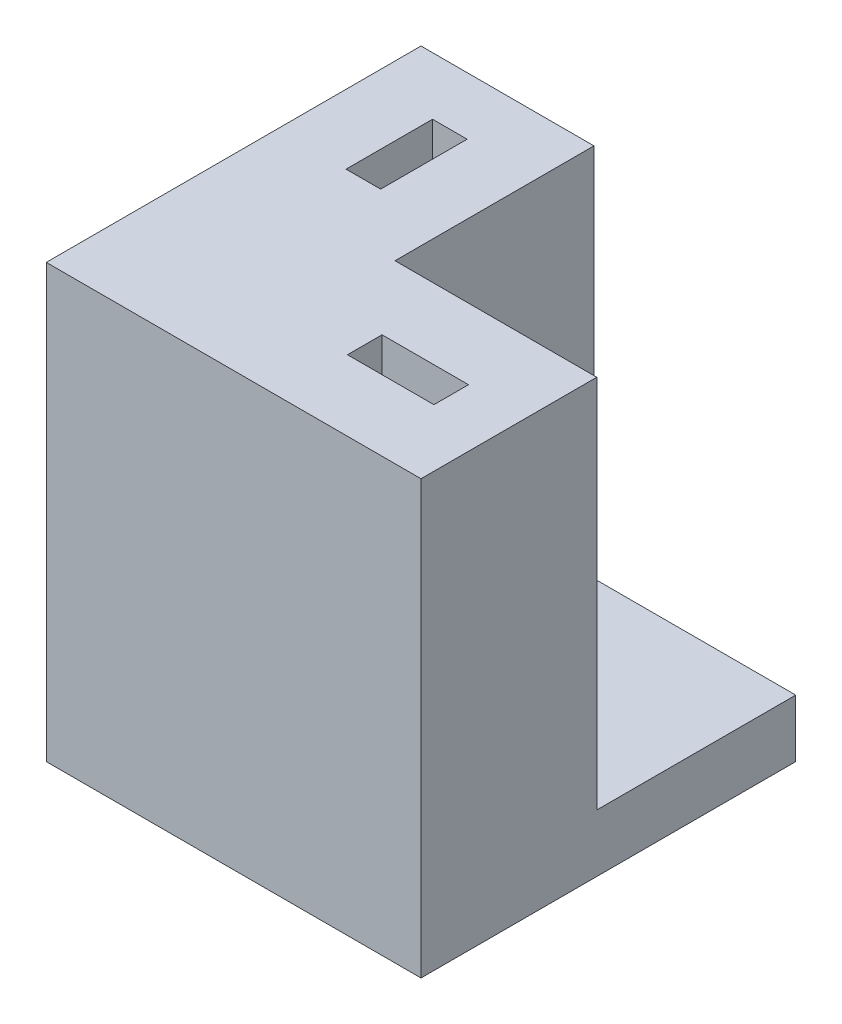
ISO-10303-21;
HEADER;
FILE_DESCRIPTION(('STEP AP214'),'2;1');
FILE_NAME('part.step','',(''),(''),'','','');
FILE_SCHEMA(('AUTOMOTIVE_DESIGN { 1 0 10303 214 1 1 1 1 }'));
ENDSEC;
DATA;
#1=APPLICATION_CONTEXT('core data for automotive mechanical design processes');
#2=APPLICATION_PROTOCOL_DEFINITION('international standard','automotive_design',2000,#1);
#3=PRODUCT_CONTEXT('',#1,'mechanical');
#4=PRODUCT('Part','Part','',(#3));
#5=PRODUCT_RELATED_PRODUCT_CATEGORY('part','',(#4));
#6=PRODUCT_DEFINITION_FORMATION('','',#4);
#7=PRODUCT_DEFINITION_CONTEXT('part definition',#1,'design');
#8=PRODUCT_DEFINITION('design','',#6,#7);
#9=PRODUCT_DEFINITION_SHAPE('','',#8);
#10=(LENGTH_UNIT() NAMED_UNIT(*) SI_UNIT(.MILLI.,.METRE.));
#11=(NAMED_UNIT(*) PLANE_ANGLE_UNIT() SI_UNIT($,.RADIAN.));
#12=(NAMED_UNIT(*) SI_UNIT($,.STERADIAN.) SOLID_ANGLE_UNIT());
#13=UNCERTAINTY_MEASURE_WITH_UNIT(LENGTH_MEASURE(1.E-05),#10,'distance_accuracy_value','');
#14=(GEOMETRIC_REPRESENTATION_CONTEXT(3) GLOBAL_UNCERTAINTY_ASSIGNED_CONTEXT((#13)) GLOBAL_UNIT_ASSIGNED_CONTEXT((#10,
#11,#12)) REPRESENTATION_CONTEXT('',''));
#15=CARTESIAN_POINT('',(0.,0.,0.));
#16=DIRECTION('',(0.,0.,1.));
#17=DIRECTION('',(1.,0.,0.));
#18=AXIS2_PLACEMENT_3D('',#15,#16,#17);
#19=CARTESIAN_POINT('',(8.255,19.05,8.255));
#20=DIRECTION('',(-1.,0.,0.));
#21=DIRECTION('',(0.,0.,1.));
#22=AXIS2_PLACEMENT_3D('',#19,#20,#21);
#23=PLANE('',#22);
#24=DIRECTION('',(0.,0.,-1.));
#25=VECTOR('',#24,1.);
#26=CARTESIAN_POINT('',(8.255,2.54,-8.255));
#27=LINE('',#26,#25);
#28=CARTESIAN_POINT('',(8.255,2.54,0.510916865217759));
#29=VERTEX_POINT('',#28);
#30=CARTESIAN_POINT('',(8.255,2.54,-8.255));
#31=VERTEX_POINT('',#30);
#32=EDGE_CURVE('E211',#29,#31,#27,.T.);
#33=ORIENTED_EDGE('',*,*,#32,.F.);
#34=DIRECTION('',(0.,1.,0.));
#35=VECTOR('',#34,1.);
#36=CARTESIAN_POINT('',(8.255,2.54,0.510916865217759));
#37=LINE('',#36,#35);
#38=CARTESIAN_POINT('',(8.255,19.05,0.510916865217759));
#39=VERTEX_POINT('',#38);
#40=EDGE_CURVE('E227',#29,#39,#37,.T.);
#41=ORIENTED_EDGE('',*,*,#40,.T.);
#42=DIRECTION('',(0.,0.,-1.));
#43=VECTOR('',#42,1.);
#44=CARTESIAN_POINT('',(8.255,19.05,8.255));
#45=LINE('',#44,#43);
#46=CARTESIAN_POINT('',(8.255,19.05,8.255));
#47=VERTEX_POINT('',#46);
#48=EDGE_CURVE('E240',#47,#39,#45,.T.);
#49=ORIENTED_EDGE('',*,*,#48,.F.);
#50=DIRECTION('',(0.,-1.,0.));
#51=VECTOR('',#50,1.);
#52=CARTESIAN_POINT('',(8.255,19.05,8.255));
#53=LINE('',#52,#51);
#54=CARTESIAN_POINT('',(8.255,0.,8.255));
#55=VERTEX_POINT('',#54);
#56=EDGE_CURVE('E250',#47,#55,#53,.T.);
#57=ORIENTED_EDGE('',*,*,#56,.T.);
#58=DIRECTION('',(0.,0.,-1.));
#59=VECTOR('',#58,1.);
#60=CARTESIAN_POINT('',(8.255,0.,8.255));
#61=LINE('',#60,#59);
#62=CARTESIAN_POINT('',(8.255,0.,-8.255));
#63=VERTEX_POINT('',#62);
#64=EDGE_CURVE('E237',#55,#63,#61,.T.);
#65=ORIENTED_EDGE('',*,*,#64,.T.);
#66=DIRECTION('',(0.,-1.,0.));
#67=VECTOR('',#66,1.);
#68=CARTESIAN_POINT('',(8.255,19.05,-8.255));
#69=LINE('',#68,#67);
#70=EDGE_CURVE('E11',#31,#63,#69,.T.);
#71=ORIENTED_EDGE('',*,*,#70,.F.);
#72=EDGE_LOOP('',(#33,#41,#49,#57,#65,#71));
#73=FACE_BOUND('',#72,.T.);
#74=ADVANCED_FACE('F37',(#73),#23,.F.);
#75=CARTESIAN_POINT('',(-8.255,19.05,-8.255));
#76=DIRECTION('',(0.,0.,1.));
#77=DIRECTION('',(1.,0.,0.));
#78=AXIS2_PLACEMENT_3D('',#75,#76,#77);
#79=PLANE('',#78);
#80=DIRECTION('',(-1.,0.,0.));
#81=VECTOR('',#80,1.);
#82=CARTESIAN_POINT('',(-8.255,19.05,-8.255));
#83=LINE('',#82,#81);
#84=CARTESIAN_POINT('',(-0.635,19.05,-8.255));
#85=VERTEX_POINT('',#84);
#86=CARTESIAN_POINT('',(-8.255,19.05,-8.255));
#87=VERTEX_POINT('',#86);
#88=EDGE_CURVE('E243',#85,#87,#83,.T.);
#89=ORIENTED_EDGE('',*,*,#88,.F.);
#90=DIRECTION('',(0.,1.,0.));
#91=VECTOR('',#90,1.);
#92=CARTESIAN_POINT('',(-0.635,2.54,-8.255));
#93=LINE('',#92,#91);
#94=CARTESIAN_POINT('',(-0.635,2.54,-8.255));
#95=VERTEX_POINT('',#94);
#96=EDGE_CURVE('E223',#95,#85,#93,.T.);
#97=ORIENTED_EDGE('',*,*,#96,.F.);
#98=DIRECTION('',(-1.,0.,0.));
#99=VECTOR('',#98,1.);
#100=CARTESIAN_POINT('',(-0.635,2.54,-8.255));
#101=LINE('',#100,#99);
#102=EDGE_CURVE('E213',#31,#95,#101,.T.);
#103=ORIENTED_EDGE('',*,*,#102,.F.);
#104=ORIENTED_EDGE('',*,*,#70,.T.);
#105=DIRECTION('',(-1.,0.,0.));
#106=VECTOR('',#105,1.);
#107=CARTESIAN_POINT('',(-8.255,0.,-8.255));
#108=LINE('',#107,#106);
#109=CARTESIAN_POINT('',(-8.255,0.,-8.255));
#110=VERTEX_POINT('',#109);
#111=EDGE_CURVE('E253',#63,#110,#108,.T.);
#112=ORIENTED_EDGE('',*,*,#111,.T.);
#113=DIRECTION('',(0.,-1.,0.));
#114=VECTOR('',#113,1.);
#115=CARTESIAN_POINT('',(-8.255,19.05,-8.255));
#116=LINE('',#115,#114);
#117=EDGE_CURVE('E44',#87,#110,#116,.T.);
#118=ORIENTED_EDGE('',*,*,#117,.F.);
#119=EDGE_LOOP('',(#89,#97,#103,#104,#112,#118));
#120=FACE_BOUND('',#119,.T.);
#121=ADVANCED_FACE('F289',(#120),#79,.F.);
#122=CARTESIAN_POINT('',(-8.255,19.05,8.255));
#123=DIRECTION('',(1.,0.,0.));
#124=DIRECTION('',(0.,0.,-1.));
#125=AXIS2_PLACEMENT_3D('',#122,#123,#124);
#126=PLANE('',#125);
#127=DIRECTION('',(0.,0.,1.));
#128=VECTOR('',#127,1.);
#129=CARTESIAN_POINT('',(-8.255,0.,8.255));
#130=LINE('',#129,#128);
#131=CARTESIAN_POINT('',(-8.255,0.,8.255));
#132=VERTEX_POINT('',#131);
#133=EDGE_CURVE('E255',#110,#132,#130,.T.);
#134=ORIENTED_EDGE('',*,*,#133,.T.);
#135=DIRECTION('',(0.,-1.,0.));
#136=VECTOR('',#135,1.);
#137=CARTESIAN_POINT('',(-8.255,19.05,8.255));
#138=LINE('',#137,#136);
#139=CARTESIAN_POINT('',(-8.255,19.05,8.255));
#140=VERTEX_POINT('',#139);
#141=EDGE_CURVE('E260',#140,#132,#138,.T.);
#142=ORIENTED_EDGE('',*,*,#141,.F.);
#143=DIRECTION('',(0.,0.,1.));
#144=VECTOR('',#143,1.);
#145=CARTESIAN_POINT('',(-8.255,19.05,8.255));
#146=LINE('',#145,#144);
#147=EDGE_CURVE('E246',#87,#140,#146,.T.);
#148=ORIENTED_EDGE('',*,*,#147,.F.);
#149=ORIENTED_EDGE('',*,*,#117,.T.);
#150=EDGE_LOOP('',(#134,#142,#148,#149));
#151=FACE_BOUND('',#150,.T.);
#152=ADVANCED_FACE('F267',(#151),#126,.F.);
#153=CARTESIAN_POINT('',(-8.255,19.05,8.255));
#154=DIRECTION('',(0.,0.,-1.));
#155=DIRECTION('',(-1.,0.,0.));
#156=AXIS2_PLACEMENT_3D('',#153,#154,#155);
#157=PLANE('',#156);
#158=DIRECTION('',(1.,0.,0.));
#159=VECTOR('',#158,1.);
#160=CARTESIAN_POINT('',(-8.255,0.,8.255));
#161=LINE('',#160,#159);
#162=EDGE_CURVE('E244',#132,#55,#161,.T.);
#163=ORIENTED_EDGE('',*,*,#162,.T.);
#164=ORIENTED_EDGE('',*,*,#56,.F.);
#165=DIRECTION('',(1.,0.,0.));
#166=VECTOR('',#165,1.);
#167=CARTESIAN_POINT('',(-8.255,19.05,8.255));
#168=LINE('',#167,#166);
#169=EDGE_CURVE('E248',#140,#47,#168,.T.);
#170=ORIENTED_EDGE('',*,*,#169,.F.);
#171=ORIENTED_EDGE('',*,*,#141,.T.);
#172=EDGE_LOOP('',(#163,#164,#170,#171));
#173=FACE_BOUND('',#172,.T.);
#174=ADVANCED_FACE('F278',(#173),#157,.F.);
#175=CARTESIAN_POINT('',(0.,19.05,0.));
#176=DIRECTION('',(0.,-1.,0.));
#177=DIRECTION('',(0.,0.,-1.));
#178=AXIS2_PLACEMENT_3D('',#175,#176,#177);
#179=PLANE('',#178);
#180=DIRECTION('',(-1.,0.,0.));
#181=VECTOR('',#180,1.);
#182=CARTESIAN_POINT('',(-5.207,19.05,-5.715));
#183=LINE('',#182,#181);
#184=CARTESIAN_POINT('',(-3.683,19.05,-5.715));
#185=VERTEX_POINT('',#184);
#186=CARTESIAN_POINT('',(-5.207,19.05,-5.715));
#187=VERTEX_POINT('',#186);
#188=EDGE_CURVE('E171',#185,#187,#183,.T.);
#189=ORIENTED_EDGE('',*,*,#188,.F.);
#190=DIRECTION('',(0.,0.,-1.));
#191=VECTOR('',#190,1.);
#192=CARTESIAN_POINT('',(-3.683,19.05,-1.905));
#193=LINE('',#192,#191);
#194=CARTESIAN_POINT('',(-3.683,19.05,-1.905));
#195=VERTEX_POINT('',#194);
#196=EDGE_CURVE('E51',#195,#185,#193,.T.);
#197=ORIENTED_EDGE('',*,*,#196,.F.);
#198=DIRECTION('',(1.,0.,0.));
#199=VECTOR('',#198,1.);
#200=CARTESIAN_POINT('',(-5.207,19.05,-1.905));
#201=LINE('',#200,#199);
#202=CARTESIAN_POINT('',(-5.207,19.05,-1.905));
#203=VERTEX_POINT('',#202);
#204=EDGE_CURVE('E162',#203,#195,#201,.T.);
#205=ORIENTED_EDGE('',*,*,#204,.F.);
#206=DIRECTION('',(0.,0.,1.));
#207=VECTOR('',#206,1.);
#208=CARTESIAN_POINT('',(-5.207,19.05,-1.905));
#209=LINE('',#208,#207);
#210=EDGE_CURVE('E165',#187,#203,#209,.T.);
#211=ORIENTED_EDGE('',*,*,#210,.F.);
#212=EDGE_LOOP('',(#189,#197,#205,#211));
#213=FACE_BOUND('',#212,.T.);
#214=DIRECTION('',(-1.,0.,0.));
#215=VECTOR('',#214,1.);
#216=CARTESIAN_POINT('',(1.905,19.05,3.62095843260888));
#217=LINE('',#216,#215);
#218=CARTESIAN_POINT('',(5.715,19.05,3.62095843260888));
#219=VERTEX_POINT('',#218);
#220=CARTESIAN_POINT('',(1.905,19.05,3.62095843260888));
#221=VERTEX_POINT('',#220);
#222=EDGE_CURVE('E197',#219,#221,#217,.T.);
#223=ORIENTED_EDGE('',*,*,#222,.F.);
#224=DIRECTION('',(0.,0.,-1.));
#225=VECTOR('',#224,1.);
#226=CARTESIAN_POINT('',(5.715,19.05,5.14495843260888));
#227=LINE('',#226,#225);
#228=CARTESIAN_POINT('',(5.715,19.05,5.14495843260888));
#229=VERTEX_POINT('',#228);
#230=EDGE_CURVE('E59',#229,#219,#227,.T.);
#231=ORIENTED_EDGE('',*,*,#230,.F.);
#232=DIRECTION('',(1.,0.,0.));
#233=VECTOR('',#232,1.);
#234=CARTESIAN_POINT('',(1.905,19.05,5.14495843260888));
#235=LINE('',#234,#233);
#236=CARTESIAN_POINT('',(1.905,19.05,5.14495843260888));
#237=VERTEX_POINT('',#236);
#238=EDGE_CURVE('E186',#237,#229,#235,.T.);
#239=ORIENTED_EDGE('',*,*,#238,.F.);
#240=DIRECTION('',(0.,0.,1.));
#241=VECTOR('',#240,1.);
#242=CARTESIAN_POINT('',(1.905,19.05,5.14495843260888));
#243=LINE('',#242,#241);
#244=EDGE_CURVE('E200',#221,#237,#243,.T.);
#245=ORIENTED_EDGE('',*,*,#244,.F.);
#246=EDGE_LOOP('',(#223,#231,#239,#245));
#247=FACE_BOUND('',#246,.T.);
#248=ORIENTED_EDGE('',*,*,#48,.T.);
#249=DIRECTION('',(1.,0.,0.));
#250=VECTOR('',#249,1.);
#251=CARTESIAN_POINT('',(8.255,19.05,0.510916865217759));
#252=LINE('',#251,#250);
#253=CARTESIAN_POINT('',(-0.635,19.05,0.51091686521776));
#254=VERTEX_POINT('',#253);
#255=EDGE_CURVE('E214',#254,#39,#252,.T.);
#256=ORIENTED_EDGE('',*,*,#255,.F.);
#257=DIRECTION('',(0.,0.,1.));
#258=VECTOR('',#257,1.);
#259=CARTESIAN_POINT('',(-0.635,19.05,0.51091686521776));
#260=LINE('',#259,#258);
#261=EDGE_CURVE('E178',#85,#254,#260,.T.);
#262=ORIENTED_EDGE('',*,*,#261,.F.);
#263=ORIENTED_EDGE('',*,*,#88,.T.);
#264=ORIENTED_EDGE('',*,*,#147,.T.);
#265=ORIENTED_EDGE('',*,*,#169,.T.);
#266=EDGE_LOOP('',(#248,#256,#262,#263,#264,#265));
#267=FACE_BOUND('',#266,.T.);
#268=ADVANCED_FACE('F286',(#213,#247,#267),#179,.F.);
#269=CARTESIAN_POINT('',(0.,0.,0.));
#270=DIRECTION('',(0.,-1.,0.));
#271=DIRECTION('',(0.,0.,-1.));
#272=AXIS2_PLACEMENT_3D('',#269,#270,#271);
#273=PLANE('',#272);
#274=CARTESIAN_POINT('',(-4.1275,0.,4.1275));
#275=DIRECTION('',(0.,-1.,0.));
#276=DIRECTION('',(0.,0.,-1.));
#277=AXIS2_PLACEMENT_3D('',#274,#275,#276);
#278=CIRCLE('',#277,2.54);
#279=CARTESIAN_POINT('',(-4.1275,0.,1.5875));
#280=VERTEX_POINT('',#279);
#281=EDGE_CURVE('E230',#280,#280,#278,.T.);
#282=ORIENTED_EDGE('',*,*,#281,.F.);
#283=EDGE_LOOP('',(#282));
#284=FACE_BOUND('',#283,.T.);
#285=ORIENTED_EDGE('',*,*,#64,.F.);
#286=ORIENTED_EDGE('',*,*,#162,.F.);
#287=ORIENTED_EDGE('',*,*,#133,.F.);
#288=ORIENTED_EDGE('',*,*,#111,.F.);
#289=EDGE_LOOP('',(#285,#286,#287,#288));
#290=FACE_BOUND('',#289,.T.);
#291=ADVANCED_FACE('F275',(#284,#290),#273,.T.);
#292=CARTESIAN_POINT('',(-4.1275,5.715,4.1275));
#293=DIRECTION('',(0.,-1.,0.));
#294=DIRECTION('',(0.,0.,-1.));
#295=AXIS2_PLACEMENT_3D('',#292,#293,#294);
#296=CYLINDRICAL_SURFACE('',#295,2.54);
#297=CARTESIAN_POINT('',(-4.1275,5.715,4.1275));
#298=DIRECTION('',(0.,-1.,0.));
#299=DIRECTION('',(0.,0.,-1.));
#300=AXIS2_PLACEMENT_3D('',#297,#298,#299);
#301=CIRCLE('',#300,2.54);
#302=CARTESIAN_POINT('',(-4.1275,5.715,1.5875));
#303=VERTEX_POINT('',#302);
#304=EDGE_CURVE('E234',#303,#303,#301,.T.);
#305=ORIENTED_EDGE('',*,*,#304,.F.);
#306=EDGE_LOOP('',(#305));
#307=FACE_BOUND('',#306,.T.);
#308=ORIENTED_EDGE('',*,*,#281,.T.);
#309=EDGE_LOOP('',(#308));
#310=FACE_BOUND('',#309,.T.);
#311=ADVANCED_FACE('F306',(#307,#310),#296,.F.);
#312=CARTESIAN_POINT('',(-4.1275,5.715,4.1275));
#313=DIRECTION('',(0.,-1.,0.));
#314=DIRECTION('',(0.,0.,-1.));
#315=AXIS2_PLACEMENT_3D('',#312,#313,#314);
#316=PLANE('',#315);
#317=ORIENTED_EDGE('',*,*,#304,.T.);
#318=EDGE_LOOP('',(#317));
#319=FACE_BOUND('',#318,.T.);
#320=ADVANCED_FACE('F299',(#319),#316,.T.);
#321=CARTESIAN_POINT('',(8.255,2.54,0.510916865217759));
#322=DIRECTION('',(0.,0.,1.));
#323=DIRECTION('',(1.,0.,0.));
#324=AXIS2_PLACEMENT_3D('',#321,#322,#323);
#325=PLANE('',#324);
#326=ORIENTED_EDGE('',*,*,#255,.T.);
#327=ORIENTED_EDGE('',*,*,#40,.F.);
#328=DIRECTION('',(1.,0.,0.));
#329=VECTOR('',#328,1.);
#330=CARTESIAN_POINT('',(8.255,2.54,0.510916865217759));
#331=LINE('',#330,#329);
#332=CARTESIAN_POINT('',(-0.635,2.54,0.51091686521776));
#333=VERTEX_POINT('',#332);
#334=EDGE_CURVE('E220',#333,#29,#331,.T.);
#335=ORIENTED_EDGE('',*,*,#334,.F.);
#336=DIRECTION('',(0.,1.,0.));
#337=VECTOR('',#336,1.);
#338=CARTESIAN_POINT('',(-0.635,2.54,0.51091686521776));
#339=LINE('',#338,#337);
#340=EDGE_CURVE('E231',#333,#254,#339,.T.);
#341=ORIENTED_EDGE('',*,*,#340,.T.);
#342=EDGE_LOOP('',(#326,#327,#335,#341));
#343=FACE_BOUND('',#342,.T.);
#344=ADVANCED_FACE('F297',(#343),#325,.F.);
#345=CARTESIAN_POINT('',(-0.635,2.54,0.51091686521776));
#346=DIRECTION('',(-1.,0.,0.));
#347=DIRECTION('',(0.,0.,1.));
#348=AXIS2_PLACEMENT_3D('',#345,#346,#347);
#349=PLANE('',#348);
#350=ORIENTED_EDGE('',*,*,#261,.T.);
#351=ORIENTED_EDGE('',*,*,#340,.F.);
#352=DIRECTION('',(0.,0.,1.));
#353=VECTOR('',#352,1.);
#354=CARTESIAN_POINT('',(-0.635,2.54,0.51091686521776));
#355=LINE('',#354,#353);
#356=EDGE_CURVE('E217',#95,#333,#355,.T.);
#357=ORIENTED_EDGE('',*,*,#356,.F.);
#358=ORIENTED_EDGE('',*,*,#96,.T.);
#359=EDGE_LOOP('',(#350,#351,#357,#358));
#360=FACE_BOUND('',#359,.T.);
#361=ADVANCED_FACE('F292',(#360),#349,.F.);
#362=CARTESIAN_POINT('',(0.,2.54,0.));
#363=DIRECTION('',(0.,-1.,0.));
#364=DIRECTION('',(0.,0.,-1.));
#365=AXIS2_PLACEMENT_3D('',#362,#363,#364);
#366=PLANE('',#365);
#367=ORIENTED_EDGE('',*,*,#32,.T.);
#368=ORIENTED_EDGE('',*,*,#102,.T.);
#369=ORIENTED_EDGE('',*,*,#356,.T.);
#370=ORIENTED_EDGE('',*,*,#334,.T.);
#371=EDGE_LOOP('',(#367,#368,#369,#370));
#372=FACE_BOUND('',#371,.T.);
#373=ADVANCED_FACE('F295',(#372),#366,.F.);
#374=CARTESIAN_POINT('',(5.715,16.51,5.14495843260888));
#375=DIRECTION('',(1.,0.,0.));
#376=DIRECTION('',(0.,0.,-1.));
#377=AXIS2_PLACEMENT_3D('',#374,#375,#376);
#378=PLANE('',#377);
#379=ORIENTED_EDGE('',*,*,#230,.T.);
#380=DIRECTION('',(0.,1.,0.));
#381=VECTOR('',#380,1.);
#382=CARTESIAN_POINT('',(5.715,16.51,3.62095843260888));
#383=LINE('',#382,#381);
#384=CARTESIAN_POINT('',(5.715,16.51,3.62095843260888));
#385=VERTEX_POINT('',#384);
#386=EDGE_CURVE('E195',#385,#219,#383,.T.);
#387=ORIENTED_EDGE('',*,*,#386,.F.);
#388=DIRECTION('',(0.,0.,-1.));
#389=VECTOR('',#388,1.);
#390=CARTESIAN_POINT('',(5.715,16.51,5.14495843260888));
#391=LINE('',#390,#389);
#392=CARTESIAN_POINT('',(5.715,16.51,5.14495843260888));
#393=VERTEX_POINT('',#392);
#394=EDGE_CURVE('E182',#393,#385,#391,.T.);
#395=ORIENTED_EDGE('',*,*,#394,.F.);
#396=DIRECTION('',(0.,1.,0.));
#397=VECTOR('',#396,1.);
#398=CARTESIAN_POINT('',(5.715,16.51,5.14495843260888));
#399=LINE('',#398,#397);
#400=EDGE_CURVE('E172',#393,#229,#399,.T.);
#401=ORIENTED_EDGE('',*,*,#400,.T.);
#402=EDGE_LOOP('',(#379,#387,#395,#401));
#403=FACE_BOUND('',#402,.T.);
#404=ADVANCED_FACE('F368',(#403),#378,.F.);
#405=CARTESIAN_POINT('',(1.905,16.51,5.14495843260888));
#406=DIRECTION('',(0.,0.,1.));
#407=DIRECTION('',(1.,0.,0.));
#408=AXIS2_PLACEMENT_3D('',#405,#406,#407);
#409=PLANE('',#408);
#410=ORIENTED_EDGE('',*,*,#238,.T.);
#411=ORIENTED_EDGE('',*,*,#400,.F.);
#412=DIRECTION('',(1.,0.,0.));
#413=VECTOR('',#412,1.);
#414=CARTESIAN_POINT('',(1.905,16.51,5.14495843260888));
#415=LINE('',#414,#413);
#416=CARTESIAN_POINT('',(1.905,16.51,5.14495843260888));
#417=VERTEX_POINT('',#416);
#418=EDGE_CURVE('E192',#417,#393,#415,.T.);
#419=ORIENTED_EDGE('',*,*,#418,.F.);
#420=DIRECTION('',(0.,1.,0.));
#421=VECTOR('',#420,1.);
#422=CARTESIAN_POINT('',(1.905,16.51,5.14495843260888));
#423=LINE('',#422,#421);
#424=EDGE_CURVE('E206',#417,#237,#423,.T.);
#425=ORIENTED_EDGE('',*,*,#424,.T.);
#426=EDGE_LOOP('',(#410,#411,#419,#425));
#427=FACE_BOUND('',#426,.T.);
#428=ADVANCED_FACE('F384',(#427),#409,.F.);
#429=CARTESIAN_POINT('',(1.905,16.51,5.14495843260888));
#430=DIRECTION('',(-1.,0.,0.));
#431=DIRECTION('',(0.,0.,1.));
#432=AXIS2_PLACEMENT_3D('',#429,#430,#431);
#433=PLANE('',#432);
#434=ORIENTED_EDGE('',*,*,#244,.T.);
#435=ORIENTED_EDGE('',*,*,#424,.F.);
#436=DIRECTION('',(0.,0.,1.));
#437=VECTOR('',#436,1.);
#438=CARTESIAN_POINT('',(1.905,16.51,5.14495843260888));
#439=LINE('',#438,#437);
#440=CARTESIAN_POINT('',(1.905,16.51,3.62095843260888));
#441=VERTEX_POINT('',#440);
#442=EDGE_CURVE('E189',#441,#417,#439,.T.);
#443=ORIENTED_EDGE('',*,*,#442,.F.);
#444=DIRECTION('',(0.,1.,0.));
#445=VECTOR('',#444,1.);
#446=CARTESIAN_POINT('',(1.905,16.51,3.62095843260888));
#447=LINE('',#446,#445);
#448=EDGE_CURVE('E208',#441,#221,#447,.T.);
#449=ORIENTED_EDGE('',*,*,#448,.T.);
#450=EDGE_LOOP('',(#434,#435,#443,#449));
#451=FACE_BOUND('',#450,.T.);
#452=ADVANCED_FACE('F393',(#451),#433,.F.);
#453=CARTESIAN_POINT('',(1.905,16.51,3.62095843260888));
#454=DIRECTION('',(0.,0.,-1.));
#455=DIRECTION('',(-1.,0.,0.));
#456=AXIS2_PLACEMENT_3D('',#453,#454,#455);
#457=PLANE('',#456);
#458=ORIENTED_EDGE('',*,*,#222,.T.);
#459=ORIENTED_EDGE('',*,*,#448,.F.);
#460=DIRECTION('',(-1.,0.,0.));
#461=VECTOR('',#460,1.);
#462=CARTESIAN_POINT('',(1.905,16.51,3.62095843260888));
#463=LINE('',#462,#461);
#464=EDGE_CURVE('E185',#385,#441,#463,.T.);
#465=ORIENTED_EDGE('',*,*,#464,.F.);
#466=ORIENTED_EDGE('',*,*,#386,.T.);
#467=EDGE_LOOP('',(#458,#459,#465,#466));
#468=FACE_BOUND('',#467,.T.);
#469=ADVANCED_FACE('F403',(#468),#457,.F.);
#470=CARTESIAN_POINT('',(0.,16.51,0.));
#471=DIRECTION('',(0.,-1.,0.));
#472=DIRECTION('',(0.,0.,-1.));
#473=AXIS2_PLACEMENT_3D('',#470,#471,#472);
#474=PLANE('',#473);
#475=ORIENTED_EDGE('',*,*,#394,.T.);
#476=ORIENTED_EDGE('',*,*,#464,.T.);
#477=ORIENTED_EDGE('',*,*,#442,.T.);
#478=ORIENTED_EDGE('',*,*,#418,.T.);
#479=EDGE_LOOP('',(#475,#476,#477,#478));
#480=FACE_BOUND('',#479,.T.);
#481=ADVANCED_FACE('F413',(#480),#474,.F.);
#482=CARTESIAN_POINT('',(-3.683,16.51,-1.905));
#483=DIRECTION('',(1.,0.,0.));
#484=DIRECTION('',(0.,0.,-1.));
#485=AXIS2_PLACEMENT_3D('',#482,#483,#484);
#486=PLANE('',#485);
#487=ORIENTED_EDGE('',*,*,#196,.T.);
#488=DIRECTION('',(0.,1.,0.));
#489=VECTOR('',#488,1.);
#490=CARTESIAN_POINT('',(-3.683,16.51,-5.715));
#491=LINE('',#490,#489);
#492=CARTESIAN_POINT('',(-3.683,16.51,-5.715));
#493=VERTEX_POINT('',#492);
#494=EDGE_CURVE('E140',#493,#185,#491,.T.);
#495=ORIENTED_EDGE('',*,*,#494,.F.);
#496=DIRECTION('',(0.,0.,-1.));
#497=VECTOR('',#496,1.);
#498=CARTESIAN_POINT('',(-3.683,16.51,-1.905));
#499=LINE('',#498,#497);
#500=CARTESIAN_POINT('',(-3.683,16.51,-1.905));
#501=VERTEX_POINT('',#500);
#502=EDGE_CURVE('E144',#501,#493,#499,.T.);
#503=ORIENTED_EDGE('',*,*,#502,.F.);
#504=DIRECTION('',(0.,1.,0.));
#505=VECTOR('',#504,1.);
#506=CARTESIAN_POINT('',(-3.683,16.51,-1.905));
#507=LINE('',#506,#505);
#508=EDGE_CURVE('E176',#501,#195,#507,.T.);
#509=ORIENTED_EDGE('',*,*,#508,.T.);
#510=EDGE_LOOP('',(#487,#495,#503,#509));
#511=FACE_BOUND('',#510,.T.);
#512=ADVANCED_FACE('F142',(#511),#486,.F.);
#513=CARTESIAN_POINT('',(-5.207,16.51,-1.905));
#514=DIRECTION('',(0.,0.,1.));
#515=DIRECTION('',(1.,0.,0.));
#516=AXIS2_PLACEMENT_3D('',#513,#514,#515);
#517=PLANE('',#516);
#518=ORIENTED_EDGE('',*,*,#204,.T.);
#519=ORIENTED_EDGE('',*,*,#508,.F.);
#520=DIRECTION('',(1.,0.,0.));
#521=VECTOR('',#520,1.);
#522=CARTESIAN_POINT('',(-5.207,16.51,-1.905));
#523=LINE('',#522,#521);
#524=CARTESIAN_POINT('',(-5.207,16.51,-1.905));
#525=VERTEX_POINT('',#524);
#526=EDGE_CURVE('E150',#525,#501,#523,.T.);
#527=ORIENTED_EDGE('',*,*,#526,.F.);
#528=DIRECTION('',(0.,1.,0.));
#529=VECTOR('',#528,1.);
#530=CARTESIAN_POINT('',(-5.207,16.51,-1.905));
#531=LINE('',#530,#529);
#532=EDGE_CURVE('E179',#525,#203,#531,.T.);
#533=ORIENTED_EDGE('',*,*,#532,.T.);
#534=EDGE_LOOP('',(#518,#519,#527,#533));
#535=FACE_BOUND('',#534,.T.);
#536=ADVANCED_FACE('F432',(#535),#517,.F.);
#537=CARTESIAN_POINT('',(-5.207,16.51,-1.905));
#538=DIRECTION('',(-1.,0.,0.));
#539=DIRECTION('',(0.,0.,1.));
#540=AXIS2_PLACEMENT_3D('',#537,#538,#539);
#541=PLANE('',#540);
#542=ORIENTED_EDGE('',*,*,#210,.T.);
#543=ORIENTED_EDGE('',*,*,#532,.F.);
#544=DIRECTION('',(0.,0.,1.));
#545=VECTOR('',#544,1.);
#546=CARTESIAN_POINT('',(-5.207,16.51,-1.905));
#547=LINE('',#546,#545);
#548=CARTESIAN_POINT('',(-5.207,16.51,-5.715));
#549=VERTEX_POINT('',#548);
#550=EDGE_CURVE('E158',#549,#525,#547,.T.);
#551=ORIENTED_EDGE('',*,*,#550,.F.);
#552=DIRECTION('',(0.,1.,0.));
#553=VECTOR('',#552,1.);
#554=CARTESIAN_POINT('',(-5.207,16.51,-5.715));
#555=LINE('',#554,#553);
#556=EDGE_CURVE('E149',#549,#187,#555,.T.);
#557=ORIENTED_EDGE('',*,*,#556,.T.);
#558=EDGE_LOOP('',(#542,#543,#551,#557));
#559=FACE_BOUND('',#558,.T.);
#560=ADVANCED_FACE('F441',(#559),#541,.F.);
#561=CARTESIAN_POINT('',(-5.207,16.51,-5.715));
#562=DIRECTION('',(0.,0.,-1.));
#563=DIRECTION('',(-1.,0.,0.));
#564=AXIS2_PLACEMENT_3D('',#561,#562,#563);
#565=PLANE('',#564);
#566=ORIENTED_EDGE('',*,*,#188,.T.);
#567=ORIENTED_EDGE('',*,*,#556,.F.);
#568=DIRECTION('',(-1.,0.,0.));
#569=VECTOR('',#568,1.);
#570=CARTESIAN_POINT('',(-5.207,16.51,-5.715));
#571=LINE('',#570,#569);
#572=EDGE_CURVE('E153',#493,#549,#571,.T.);
#573=ORIENTED_EDGE('',*,*,#572,.F.);
#574=ORIENTED_EDGE('',*,*,#494,.T.);
#575=EDGE_LOOP('',(#566,#567,#573,#574));
#576=FACE_BOUND('',#575,.T.);
#577=ADVANCED_FACE('F154',(#576),#565,.F.);
#578=CARTESIAN_POINT('',(0.,16.51,0.));
#579=DIRECTION('',(0.,-1.,0.));
#580=DIRECTION('',(0.,0.,-1.));
#581=AXIS2_PLACEMENT_3D('',#578,#579,#580);
#582=PLANE('',#581);
#583=ORIENTED_EDGE('',*,*,#502,.T.);
#584=ORIENTED_EDGE('',*,*,#572,.T.);
#585=ORIENTED_EDGE('',*,*,#550,.T.);
#586=ORIENTED_EDGE('',*,*,#526,.T.);
#587=EDGE_LOOP('',(#583,#584,#585,#586));
#588=FACE_BOUND('',#587,.T.);
#589=ADVANCED_FACE('F160',(#588),#582,.F.);
#590=CLOSED_SHELL('',(#74,#121,#152,#174,#268,#291,#311,#320,#344,#361,#373,#404,#428,#452,#469,
#481,#512,#536,#560,#577,#589));
#591=MANIFOLD_SOLID_BREP('B2',#590);
#592=ADVANCED_BREP_SHAPE_REPRESENTATION('',(#18,#591),#14);
#593=SHAPE_DEFINITION_REPRESENTATION(#9,#592);
ENDSEC;
END-ISO-10303-21;
